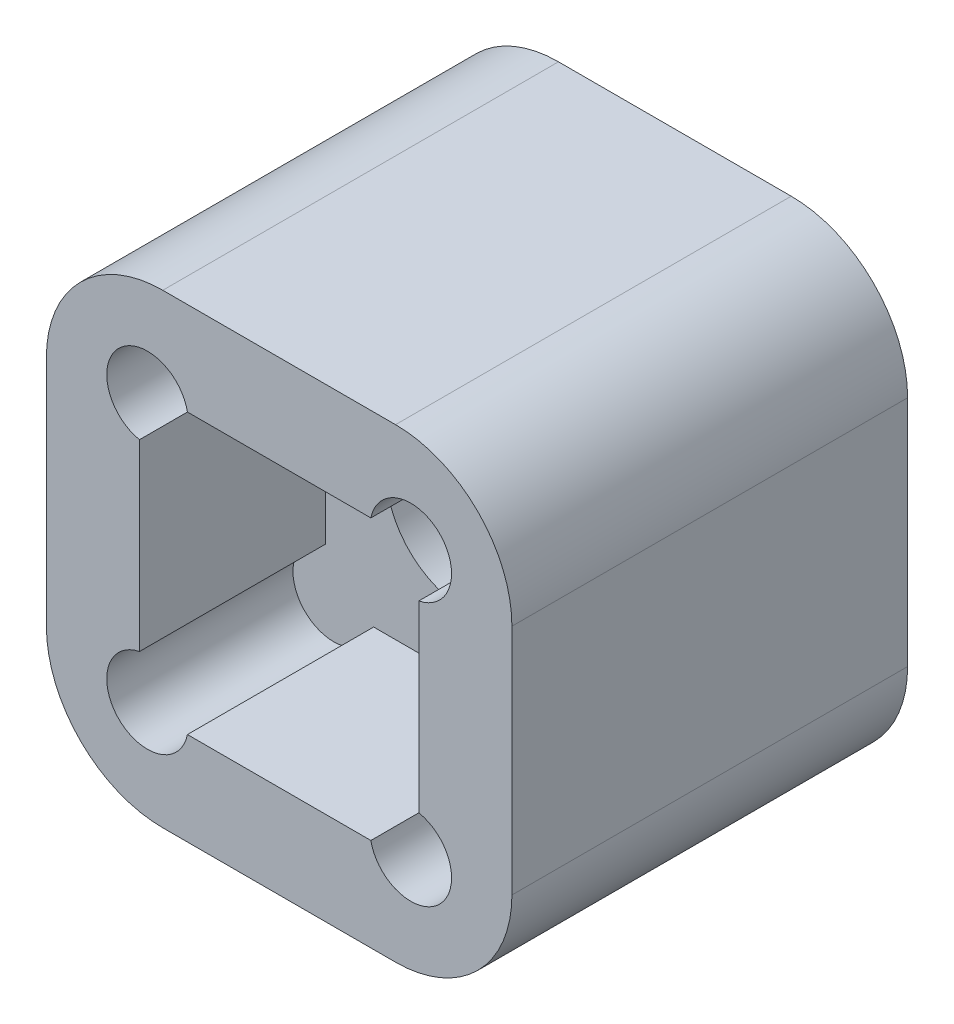
ISO-10303-21;
HEADER;
FILE_DESCRIPTION(('STEP AP214'),'2;1');
FILE_NAME('part.step','',(''),(''),'','','');
FILE_SCHEMA(('AUTOMOTIVE_DESIGN { 1 0 10303 214 1 1 1 1 }'));
ENDSEC;
DATA;
#1=APPLICATION_CONTEXT('core data for automotive mechanical design processes');
#2=APPLICATION_PROTOCOL_DEFINITION('international standard','automotive_design',2000,#1);
#3=PRODUCT_CONTEXT('',#1,'mechanical');
#4=PRODUCT('Part','Part','',(#3));
#5=PRODUCT_RELATED_PRODUCT_CATEGORY('part','',(#4));
#6=PRODUCT_DEFINITION_FORMATION('','',#4);
#7=PRODUCT_DEFINITION_CONTEXT('part definition',#1,'design');
#8=PRODUCT_DEFINITION('design','',#6,#7);
#9=PRODUCT_DEFINITION_SHAPE('','',#8);
#10=(LENGTH_UNIT() NAMED_UNIT(*) SI_UNIT(.MILLI.,.METRE.));
#11=(NAMED_UNIT(*) PLANE_ANGLE_UNIT() SI_UNIT($,.RADIAN.));
#12=(NAMED_UNIT(*) SI_UNIT($,.STERADIAN.) SOLID_ANGLE_UNIT());
#13=UNCERTAINTY_MEASURE_WITH_UNIT(LENGTH_MEASURE(1.E-05),#10,'distance_accuracy_value','');
#14=(GEOMETRIC_REPRESENTATION_CONTEXT(3) GLOBAL_UNCERTAINTY_ASSIGNED_CONTEXT((#13)) GLOBAL_UNIT_ASSIGNED_CONTEXT((#10,
#11,#12)) REPRESENTATION_CONTEXT('',''));
#15=CARTESIAN_POINT('',(0.,0.,0.));
#16=DIRECTION('',(0.,0.,1.));
#17=DIRECTION('',(1.,0.,0.));
#18=AXIS2_PLACEMENT_3D('',#15,#16,#17);
#19=CARTESIAN_POINT('',(0.,0.,0.));
#20=DIRECTION('',(0.,0.,-1.));
#21=DIRECTION('',(-1.,0.,0.));
#22=AXIS2_PLACEMENT_3D('',#19,#20,#21);
#23=CONICAL_SURFACE('',#22,3.15,0.785398163397448);
#24=CARTESIAN_POINT('',(0.,0.,1.45));
#25=DIRECTION('',(0.,0.,-1.));
#26=DIRECTION('',(-1.,0.,0.));
#27=AXIS2_PLACEMENT_3D('',#24,#25,#26);
#28=CIRCLE('',#27,1.7);
#29=CARTESIAN_POINT('',(1.7,0.,1.45));
#30=VERTEX_POINT('',#29);
#31=CARTESIAN_POINT('',(-1.7,0.,1.45));
#32=VERTEX_POINT('',#31);
#33=EDGE_CURVE('E41',#30,#32,#28,.T.);
#34=ORIENTED_EDGE('',*,*,#33,.F.);
#35=DIRECTION('',(0.707106781186547,0.,-0.707106781186548));
#36=VECTOR('',#35,1.);
#37=CARTESIAN_POINT('',(3.15,0.,0.));
#38=LINE('',#37,#36);
#39=CARTESIAN_POINT('',(3.15,0.,0.));
#40=VERTEX_POINT('',#39);
#41=EDGE_CURVE('E11',#30,#40,#38,.T.);
#42=ORIENTED_EDGE('',*,*,#41,.T.);
#43=CARTESIAN_POINT('',(0.,0.,0.));
#44=DIRECTION('',(0.,0.,-1.));
#45=DIRECTION('',(-1.,0.,0.));
#46=AXIS2_PLACEMENT_3D('',#43,#44,#45);
#47=CIRCLE('',#46,3.15);
#48=CARTESIAN_POINT('',(-3.15,0.,0.));
#49=VERTEX_POINT('',#48);
#50=EDGE_CURVE('E27',#40,#49,#47,.T.);
#51=ORIENTED_EDGE('',*,*,#50,.T.);
#52=DIRECTION('',(-0.707106781186547,0.,-0.707106781186548));
#53=VECTOR('',#52,1.);
#54=CARTESIAN_POINT('',(-3.15,0.,0.));
#55=LINE('',#54,#53);
#56=EDGE_CURVE('E266',#32,#49,#55,.T.);
#57=ORIENTED_EDGE('',*,*,#56,.F.);
#58=EDGE_LOOP('',(#34,#42,#51,#57));
#59=FACE_BOUND('',#58,.T.);
#60=ADVANCED_FACE('F16',(#59),#23,.F.);
#61=CARTESIAN_POINT('',(0.,0.,0.));
#62=DIRECTION('',(0.,0.,-1.));
#63=DIRECTION('',(-1.,0.,0.));
#64=AXIS2_PLACEMENT_3D('',#61,#62,#63);
#65=CYLINDRICAL_SURFACE('',#64,1.7);
#66=CARTESIAN_POINT('',(0.,0.,4.5));
#67=DIRECTION('',(0.,0.,-1.));
#68=DIRECTION('',(-1.,0.,0.));
#69=AXIS2_PLACEMENT_3D('',#66,#67,#68);
#70=CIRCLE('',#69,1.7);
#71=CARTESIAN_POINT('',(1.7,0.,4.5));
#72=VERTEX_POINT('',#71);
#73=CARTESIAN_POINT('',(-1.7,0.,4.5));
#74=VERTEX_POINT('',#73);
#75=EDGE_CURVE('E289',#72,#74,#70,.T.);
#76=ORIENTED_EDGE('',*,*,#75,.F.);
#77=DIRECTION('',(0.,0.,-1.));
#78=VECTOR('',#77,1.);
#79=CARTESIAN_POINT('',(1.7,0.,0.));
#80=LINE('',#79,#78);
#81=EDGE_CURVE('E264',#72,#30,#80,.T.);
#82=ORIENTED_EDGE('',*,*,#81,.T.);
#83=ORIENTED_EDGE('',*,*,#33,.T.);
#84=DIRECTION('',(0.,0.,-1.));
#85=VECTOR('',#84,1.);
#86=CARTESIAN_POINT('',(-1.7,0.,0.));
#87=LINE('',#86,#85);
#88=EDGE_CURVE('E260',#74,#32,#87,.T.);
#89=ORIENTED_EDGE('',*,*,#88,.F.);
#90=EDGE_LOOP('',(#76,#82,#83,#89));
#91=FACE_BOUND('',#90,.T.);
#92=ADVANCED_FACE('F687',(#91),#65,.F.);
#93=CARTESIAN_POINT('',(2.82842712474619,-2.82842712474619,2.02512626584708));
#94=DIRECTION('',(0.,0.,1.));
#95=DIRECTION('',(1.,0.,0.));
#96=AXIS2_PLACEMENT_3D('',#93,#94,#95);
#97=CYLINDRICAL_SURFACE('',#96,0.875);
#98=CARTESIAN_POINT('',(2.82842712474619,-2.82842712474619,4.5));
#99=DIRECTION('',(0.,0.,1.));
#100=DIRECTION('',(-1.,0.,0.));
#101=AXIS2_PLACEMENT_3D('',#98,#99,#100);
#102=CIRCLE('',#101,0.875);
#103=CARTESIAN_POINT('',(3.70342712474619,-2.82842712474619,4.5));
#104=VERTEX_POINT('',#103);
#105=CARTESIAN_POINT('',(3.,-1.97041328541891,4.5));
#106=VERTEX_POINT('',#105);
#107=EDGE_CURVE('E338',#104,#106,#102,.T.);
#108=ORIENTED_EDGE('',*,*,#107,.F.);
#109=DIRECTION('',(0.,0.,1.));
#110=VECTOR('',#109,1.);
#111=CARTESIAN_POINT('',(3.70342712474619,-2.82842712474619,2.02512626584708));
#112=LINE('',#111,#110);
#113=CARTESIAN_POINT('',(3.70342712474619,-2.82842712474619,8.5));
#114=VERTEX_POINT('',#113);
#115=EDGE_CURVE('E286',#104,#114,#112,.T.);
#116=ORIENTED_EDGE('',*,*,#115,.T.);
#117=CARTESIAN_POINT('',(2.82842712474619,-2.82842712474619,8.5));
#118=DIRECTION('',(0.,0.,1.));
#119=DIRECTION('',(1.,0.,0.));
#120=AXIS2_PLACEMENT_3D('',#117,#118,#119);
#121=CIRCLE('',#120,0.875);
#122=CARTESIAN_POINT('',(3.,-1.97041328541891,8.5));
#123=VERTEX_POINT('',#122);
#124=EDGE_CURVE('E83',#114,#123,#121,.T.);
#125=ORIENTED_EDGE('',*,*,#124,.T.);
#126=DIRECTION('',(0.,0.,1.));
#127=VECTOR('',#126,1.);
#128=CARTESIAN_POINT('',(3.,-1.97041328541891,2.02512626584708));
#129=LINE('',#128,#127);
#130=EDGE_CURVE('E100',#106,#123,#129,.T.);
#131=ORIENTED_EDGE('',*,*,#130,.F.);
#132=EDGE_LOOP('',(#108,#116,#125,#131));
#133=FACE_BOUND('',#132,.T.);
#134=ADVANCED_FACE('F691',(#133),#97,.F.);
#135=CARTESIAN_POINT('',(2.82842712474619,2.82842712474619,2.02512626584708));
#136=DIRECTION('',(0.,0.,1.));
#137=DIRECTION('',(1.,0.,0.));
#138=AXIS2_PLACEMENT_3D('',#135,#136,#137);
#139=CYLINDRICAL_SURFACE('',#138,0.875);
#140=CARTESIAN_POINT('',(2.82842712474619,2.82842712474619,4.5));
#141=DIRECTION('',(0.,0.,1.));
#142=DIRECTION('',(-1.,0.,0.));
#143=AXIS2_PLACEMENT_3D('',#140,#141,#142);
#144=CIRCLE('',#143,0.875);
#145=CARTESIAN_POINT('',(3.70342712474619,2.82842712474619,4.5));
#146=VERTEX_POINT('',#145);
#147=CARTESIAN_POINT('',(1.97041328541891,3.,4.5));
#148=VERTEX_POINT('',#147);
#149=EDGE_CURVE('E240',#146,#148,#144,.T.);
#150=ORIENTED_EDGE('',*,*,#149,.F.);
#151=DIRECTION('',(0.,0.,1.));
#152=VECTOR('',#151,1.);
#153=CARTESIAN_POINT('',(3.70342712474619,2.82842712474619,2.02512626584708));
#154=LINE('',#153,#152);
#155=CARTESIAN_POINT('',(3.70342712474619,2.82842712474619,8.5));
#156=VERTEX_POINT('',#155);
#157=EDGE_CURVE('E20',#146,#156,#154,.T.);
#158=ORIENTED_EDGE('',*,*,#157,.T.);
#159=CARTESIAN_POINT('',(2.82842712474619,2.82842712474619,8.5));
#160=DIRECTION('',(0.,0.,1.));
#161=DIRECTION('',(1.,0.,0.));
#162=AXIS2_PLACEMENT_3D('',#159,#160,#161);
#163=CIRCLE('',#162,0.875);
#164=CARTESIAN_POINT('',(1.97041328541891,3.,8.5));
#165=VERTEX_POINT('',#164);
#166=EDGE_CURVE('E226',#156,#165,#163,.T.);
#167=ORIENTED_EDGE('',*,*,#166,.T.);
#168=DIRECTION('',(0.,0.,1.));
#169=VECTOR('',#168,1.);
#170=CARTESIAN_POINT('',(1.97041328541891,3.,2.02512626584708));
#171=LINE('',#170,#169);
#172=EDGE_CURVE('E376',#148,#165,#171,.T.);
#173=ORIENTED_EDGE('',*,*,#172,.F.);
#174=EDGE_LOOP('',(#150,#158,#167,#173));
#175=FACE_BOUND('',#174,.T.);
#176=ADVANCED_FACE('F239',(#175),#139,.F.);
#177=CARTESIAN_POINT('',(-5.,5.,8.5));
#178=DIRECTION('',(1.,0.,0.));
#179=DIRECTION('',(0.,1.,0.));
#180=AXIS2_PLACEMENT_3D('',#177,#178,#179);
#181=PLANE('',#180);
#182=DIRECTION('',(0.,-1.,0.));
#183=VECTOR('',#182,1.);
#184=CARTESIAN_POINT('',(-5.,5.,0.));
#185=LINE('',#184,#183);
#186=CARTESIAN_POINT('',(-5.,2.5,0.));
#187=VERTEX_POINT('',#186);
#188=CARTESIAN_POINT('',(-5.,-2.5,0.));
#189=VERTEX_POINT('',#188);
#190=EDGE_CURVE('E236',#187,#189,#185,.T.);
#191=ORIENTED_EDGE('',*,*,#190,.T.);
#192=DIRECTION('',(0.,0.,1.));
#193=VECTOR('',#192,1.);
#194=CARTESIAN_POINT('',(-5.,-2.5,8.5));
#195=LINE('',#194,#193);
#196=CARTESIAN_POINT('',(-5.,-2.5,8.5));
#197=VERTEX_POINT('',#196);
#198=EDGE_CURVE('E390',#189,#197,#195,.T.);
#199=ORIENTED_EDGE('',*,*,#198,.T.);
#200=DIRECTION('',(0.,-1.,0.));
#201=VECTOR('',#200,1.);
#202=CARTESIAN_POINT('',(-5.,5.,8.5));
#203=LINE('',#202,#201);
#204=CARTESIAN_POINT('',(-5.,2.5,8.5));
#205=VERTEX_POINT('',#204);
#206=EDGE_CURVE('E279',#205,#197,#203,.T.);
#207=ORIENTED_EDGE('',*,*,#206,.F.);
#208=DIRECTION('',(0.,0.,-1.));
#209=VECTOR('',#208,1.);
#210=CARTESIAN_POINT('',(-5.,2.5,8.5));
#211=LINE('',#210,#209);
#212=EDGE_CURVE('E401',#205,#187,#211,.T.);
#213=ORIENTED_EDGE('',*,*,#212,.T.);
#214=EDGE_LOOP('',(#191,#199,#207,#213));
#215=FACE_BOUND('',#214,.T.);
#216=ADVANCED_FACE('F697',(#215),#181,.F.);
#217=CARTESIAN_POINT('',(5.,-5.,8.5));
#218=DIRECTION('',(0.,1.,0.));
#219=DIRECTION('',(1.,0.,0.));
#220=AXIS2_PLACEMENT_3D('',#217,#218,#219);
#221=PLANE('',#220);
#222=DIRECTION('',(1.,0.,0.));
#223=VECTOR('',#222,1.);
#224=CARTESIAN_POINT('',(5.,-5.,8.5));
#225=LINE('',#224,#223);
#226=CARTESIAN_POINT('',(-2.5,-5.,8.5));
#227=VERTEX_POINT('',#226);
#228=CARTESIAN_POINT('',(2.5,-5.,8.5));
#229=VERTEX_POINT('',#228);
#230=EDGE_CURVE('E280',#227,#229,#225,.T.);
#231=ORIENTED_EDGE('',*,*,#230,.F.);
#232=DIRECTION('',(0.,0.,-1.));
#233=VECTOR('',#232,1.);
#234=CARTESIAN_POINT('',(-2.5,-5.,8.5));
#235=LINE('',#234,#233);
#236=CARTESIAN_POINT('',(-2.5,-5.,0.));
#237=VERTEX_POINT('',#236);
#238=EDGE_CURVE('E383',#227,#237,#235,.T.);
#239=ORIENTED_EDGE('',*,*,#238,.T.);
#240=DIRECTION('',(1.,0.,0.));
#241=VECTOR('',#240,1.);
#242=CARTESIAN_POINT('',(5.,-5.,0.));
#243=LINE('',#242,#241);
#244=CARTESIAN_POINT('',(2.5,-5.,0.));
#245=VERTEX_POINT('',#244);
#246=EDGE_CURVE('E379',#237,#245,#243,.T.);
#247=ORIENTED_EDGE('',*,*,#246,.T.);
#248=DIRECTION('',(0.,0.,1.));
#249=VECTOR('',#248,1.);
#250=CARTESIAN_POINT('',(2.5,-5.,8.5));
#251=LINE('',#250,#249);
#252=EDGE_CURVE('E358',#245,#229,#251,.T.);
#253=ORIENTED_EDGE('',*,*,#252,.T.);
#254=EDGE_LOOP('',(#231,#239,#247,#253));
#255=FACE_BOUND('',#254,.T.);
#256=ADVANCED_FACE('F452',(#255),#221,.F.);
#257=CARTESIAN_POINT('',(5.,5.,8.5));
#258=DIRECTION('',(-1.,0.,0.));
#259=DIRECTION('',(0.,1.,0.));
#260=AXIS2_PLACEMENT_3D('',#257,#258,#259);
#261=PLANE('',#260);
#262=DIRECTION('',(0.,1.,0.));
#263=VECTOR('',#262,1.);
#264=CARTESIAN_POINT('',(5.,5.,0.));
#265=LINE('',#264,#263);
#266=CARTESIAN_POINT('',(5.,-2.5,0.));
#267=VERTEX_POINT('',#266);
#268=CARTESIAN_POINT('',(5.,2.5,0.));
#269=VERTEX_POINT('',#268);
#270=EDGE_CURVE('E319',#267,#269,#265,.T.);
#271=ORIENTED_EDGE('',*,*,#270,.T.);
#272=DIRECTION('',(0.,0.,1.));
#273=VECTOR('',#272,1.);
#274=CARTESIAN_POINT('',(5.,2.5,8.5));
#275=LINE('',#274,#273);
#276=CARTESIAN_POINT('',(5.,2.5,8.5));
#277=VERTEX_POINT('',#276);
#278=EDGE_CURVE('E316',#269,#277,#275,.T.);
#279=ORIENTED_EDGE('',*,*,#278,.T.);
#280=DIRECTION('',(0.,1.,0.));
#281=VECTOR('',#280,1.);
#282=CARTESIAN_POINT('',(5.,5.,8.5));
#283=LINE('',#282,#281);
#284=CARTESIAN_POINT('',(5.,-2.5,8.5));
#285=VERTEX_POINT('',#284);
#286=EDGE_CURVE('E299',#285,#277,#283,.T.);
#287=ORIENTED_EDGE('',*,*,#286,.F.);
#288=DIRECTION('',(0.,0.,-1.));
#289=VECTOR('',#288,1.);
#290=CARTESIAN_POINT('',(5.,-2.5,8.5));
#291=LINE('',#290,#289);
#292=EDGE_CURVE('E320',#285,#267,#291,.T.);
#293=ORIENTED_EDGE('',*,*,#292,.T.);
#294=EDGE_LOOP('',(#271,#279,#287,#293));
#295=FACE_BOUND('',#294,.T.);
#296=ADVANCED_FACE('F460',(#295),#261,.F.);
#297=CARTESIAN_POINT('',(5.,5.,8.5));
#298=DIRECTION('',(0.,-1.,0.));
#299=DIRECTION('',(0.,0.,-1.));
#300=AXIS2_PLACEMENT_3D('',#297,#298,#299);
#301=PLANE('',#300);
#302=DIRECTION('',(-1.,0.,0.));
#303=VECTOR('',#302,1.);
#304=CARTESIAN_POINT('',(5.,5.,0.));
#305=LINE('',#304,#303);
#306=CARTESIAN_POINT('',(2.5,5.,0.));
#307=VERTEX_POINT('',#306);
#308=CARTESIAN_POINT('',(-2.5,5.,0.));
#309=VERTEX_POINT('',#308);
#310=EDGE_CURVE('E361',#307,#309,#305,.T.);
#311=ORIENTED_EDGE('',*,*,#310,.T.);
#312=DIRECTION('',(0.,0.,1.));
#313=VECTOR('',#312,1.);
#314=CARTESIAN_POINT('',(-2.5,5.,8.5));
#315=LINE('',#314,#313);
#316=CARTESIAN_POINT('',(-2.5,5.,8.5));
#317=VERTEX_POINT('',#316);
#318=EDGE_CURVE('E362',#309,#317,#315,.T.);
#319=ORIENTED_EDGE('',*,*,#318,.T.);
#320=DIRECTION('',(-1.,0.,0.));
#321=VECTOR('',#320,1.);
#322=CARTESIAN_POINT('',(5.,5.,8.5));
#323=LINE('',#322,#321);
#324=CARTESIAN_POINT('',(2.5,5.,8.5));
#325=VERTEX_POINT('',#324);
#326=EDGE_CURVE('E370',#325,#317,#323,.T.);
#327=ORIENTED_EDGE('',*,*,#326,.F.);
#328=DIRECTION('',(0.,0.,-1.));
#329=VECTOR('',#328,1.);
#330=CARTESIAN_POINT('',(2.5,5.,8.5));
#331=LINE('',#330,#329);
#332=EDGE_CURVE('E327',#325,#307,#331,.T.);
#333=ORIENTED_EDGE('',*,*,#332,.T.);
#334=EDGE_LOOP('',(#311,#319,#327,#333));
#335=FACE_BOUND('',#334,.T.);
#336=ADVANCED_FACE('F674',(#335),#301,.F.);
#337=CARTESIAN_POINT('',(0.,0.,8.5));
#338=DIRECTION('',(0.,0.,-1.));
#339=DIRECTION('',(0.,-1.,0.));
#340=AXIS2_PLACEMENT_3D('',#337,#338,#339);
#341=PLANE('',#340);
#342=ORIENTED_EDGE('',*,*,#206,.T.);
#343=CARTESIAN_POINT('',(-2.5,-2.5,8.5));
#344=DIRECTION('',(0.,0.,1.));
#345=DIRECTION('',(-1.,0.,0.));
#346=AXIS2_PLACEMENT_3D('',#343,#344,#345);
#347=CIRCLE('',#346,2.5);
#348=EDGE_CURVE('E275',#197,#227,#347,.T.);
#349=ORIENTED_EDGE('',*,*,#348,.T.);
#350=ORIENTED_EDGE('',*,*,#230,.T.);
#351=CARTESIAN_POINT('',(2.5,-2.5,8.5));
#352=DIRECTION('',(0.,0.,1.));
#353=DIRECTION('',(-1.,0.,0.));
#354=AXIS2_PLACEMENT_3D('',#351,#352,#353);
#355=CIRCLE('',#354,2.5);
#356=EDGE_CURVE('E296',#229,#285,#355,.T.);
#357=ORIENTED_EDGE('',*,*,#356,.T.);
#358=ORIENTED_EDGE('',*,*,#286,.T.);
#359=CARTESIAN_POINT('',(2.5,2.5,8.5));
#360=DIRECTION('',(0.,0.,1.));
#361=DIRECTION('',(-1.,0.,0.));
#362=AXIS2_PLACEMENT_3D('',#359,#360,#361);
#363=CIRCLE('',#362,2.5);
#364=EDGE_CURVE('E307',#277,#325,#363,.T.);
#365=ORIENTED_EDGE('',*,*,#364,.T.);
#366=ORIENTED_EDGE('',*,*,#326,.T.);
#367=CARTESIAN_POINT('',(-2.5,2.5,8.5));
#368=DIRECTION('',(0.,0.,1.));
#369=DIRECTION('',(-1.,0.,0.));
#370=AXIS2_PLACEMENT_3D('',#367,#368,#369);
#371=CIRCLE('',#370,2.5);
#372=EDGE_CURVE('E366',#317,#205,#371,.T.);
#373=ORIENTED_EDGE('',*,*,#372,.T.);
#374=EDGE_LOOP('',(#342,#349,#350,#357,#358,#365,#366,#373));
#375=FACE_BOUND('',#374,.T.);
#376=DIRECTION('',(0.,1.,0.));
#377=VECTOR('',#376,1.);
#378=CARTESIAN_POINT('',(3.,-3.,8.5));
#379=LINE('',#378,#377);
#380=CARTESIAN_POINT('',(3.,1.97041328541891,8.5));
#381=VERTEX_POINT('',#380);
#382=EDGE_CURVE('E301',#123,#381,#379,.T.);
#383=ORIENTED_EDGE('',*,*,#382,.F.);
#384=ORIENTED_EDGE('',*,*,#124,.F.);
#385=CARTESIAN_POINT('',(2.82842712474619,-2.82842712474619,8.5));
#386=DIRECTION('',(0.,0.,1.));
#387=DIRECTION('',(1.,0.,0.));
#388=AXIS2_PLACEMENT_3D('',#385,#386,#387);
#389=CIRCLE('',#388,0.875);
#390=CARTESIAN_POINT('',(1.97041328541891,-3.,8.5));
#391=VERTEX_POINT('',#390);
#392=EDGE_CURVE('E249',#391,#114,#389,.T.);
#393=ORIENTED_EDGE('',*,*,#392,.F.);
#394=DIRECTION('',(1.,0.,0.));
#395=VECTOR('',#394,1.);
#396=CARTESIAN_POINT('',(-3.,-3.,8.5));
#397=LINE('',#396,#395);
#398=CARTESIAN_POINT('',(-1.97041328541891,-3.,8.5));
#399=VERTEX_POINT('',#398);
#400=EDGE_CURVE('E410',#399,#391,#397,.T.);
#401=ORIENTED_EDGE('',*,*,#400,.F.);
#402=CARTESIAN_POINT('',(-2.82842712474619,-2.82842712474619,8.5));
#403=DIRECTION('',(0.,0.,1.));
#404=DIRECTION('',(1.,0.,0.));
#405=AXIS2_PLACEMENT_3D('',#402,#403,#404);
#406=CIRCLE('',#405,0.875);
#407=CARTESIAN_POINT('',(-3.,-1.97041328541891,8.5));
#408=VERTEX_POINT('',#407);
#409=EDGE_CURVE('E256',#408,#399,#406,.T.);
#410=ORIENTED_EDGE('',*,*,#409,.F.);
#411=DIRECTION('',(0.,-1.,0.));
#412=VECTOR('',#411,1.);
#413=CARTESIAN_POINT('',(-3.,-3.,8.5));
#414=LINE('',#413,#412);
#415=CARTESIAN_POINT('',(-3.,1.97041328541891,8.5));
#416=VERTEX_POINT('',#415);
#417=EDGE_CURVE('E295',#416,#408,#414,.T.);
#418=ORIENTED_EDGE('',*,*,#417,.F.);
#419=CARTESIAN_POINT('',(-2.82842712474619,2.82842712474619,8.5));
#420=DIRECTION('',(0.,0.,1.));
#421=DIRECTION('',(1.,0.,0.));
#422=AXIS2_PLACEMENT_3D('',#419,#420,#421);
#423=CIRCLE('',#422,0.875);
#424=CARTESIAN_POINT('',(-1.97041328541891,3.,8.5));
#425=VERTEX_POINT('',#424);
#426=EDGE_CURVE('E248',#425,#416,#423,.T.);
#427=ORIENTED_EDGE('',*,*,#426,.F.);
#428=DIRECTION('',(-1.,0.,0.));
#429=VECTOR('',#428,1.);
#430=CARTESIAN_POINT('',(-3.,3.,8.5));
#431=LINE('',#430,#429);
#432=EDGE_CURVE('E232',#165,#425,#431,.T.);
#433=ORIENTED_EDGE('',*,*,#432,.F.);
#434=ORIENTED_EDGE('',*,*,#166,.F.);
#435=CARTESIAN_POINT('',(2.82842712474619,2.82842712474619,8.5));
#436=DIRECTION('',(0.,0.,1.));
#437=DIRECTION('',(1.,0.,0.));
#438=AXIS2_PLACEMENT_3D('',#435,#436,#437);
#439=CIRCLE('',#438,0.875);
#440=EDGE_CURVE('E230',#381,#156,#439,.T.);
#441=ORIENTED_EDGE('',*,*,#440,.F.);
#442=EDGE_LOOP('',(#383,#384,#393,#401,#410,#418,#427,#433,#434,#441));
#443=FACE_BOUND('',#442,.T.);
#444=ADVANCED_FACE('F228',(#375,#443),#341,.F.);
#445=CARTESIAN_POINT('',(0.,0.,0.));
#446=DIRECTION('',(0.,0.,-1.));
#447=DIRECTION('',(0.,-1.,0.));
#448=AXIS2_PLACEMENT_3D('',#445,#446,#447);
#449=PLANE('',#448);
#450=ORIENTED_EDGE('',*,*,#246,.F.);
#451=CARTESIAN_POINT('',(-2.5,-2.5,0.));
#452=DIRECTION('',(0.,0.,-1.));
#453=DIRECTION('',(-1.,0.,0.));
#454=AXIS2_PLACEMENT_3D('',#451,#452,#453);
#455=CIRCLE('',#454,2.5);
#456=EDGE_CURVE('E345',#237,#189,#455,.T.);
#457=ORIENTED_EDGE('',*,*,#456,.T.);
#458=ORIENTED_EDGE('',*,*,#190,.F.);
#459=CARTESIAN_POINT('',(-2.5,2.5,0.));
#460=DIRECTION('',(0.,0.,-1.));
#461=DIRECTION('',(-1.,0.,0.));
#462=AXIS2_PLACEMENT_3D('',#459,#460,#461);
#463=CIRCLE('',#462,2.5);
#464=EDGE_CURVE('E341',#187,#309,#463,.T.);
#465=ORIENTED_EDGE('',*,*,#464,.T.);
#466=ORIENTED_EDGE('',*,*,#310,.F.);
#467=CARTESIAN_POINT('',(2.5,2.5,0.));
#468=DIRECTION('',(0.,0.,-1.));
#469=DIRECTION('',(-1.,0.,0.));
#470=AXIS2_PLACEMENT_3D('',#467,#468,#469);
#471=CIRCLE('',#470,2.5);
#472=EDGE_CURVE('E346',#307,#269,#471,.T.);
#473=ORIENTED_EDGE('',*,*,#472,.T.);
#474=ORIENTED_EDGE('',*,*,#270,.F.);
#475=CARTESIAN_POINT('',(2.5,-2.5,0.));
#476=DIRECTION('',(0.,0.,-1.));
#477=DIRECTION('',(-1.,0.,0.));
#478=AXIS2_PLACEMENT_3D('',#475,#476,#477);
#479=CIRCLE('',#478,2.5);
#480=EDGE_CURVE('E394',#267,#245,#479,.T.);
#481=ORIENTED_EDGE('',*,*,#480,.T.);
#482=EDGE_LOOP('',(#450,#457,#458,#465,#466,#473,#474,#481));
#483=FACE_BOUND('',#482,.T.);
#484=CARTESIAN_POINT('',(0.,0.,0.));
#485=DIRECTION('',(0.,0.,-1.));
#486=DIRECTION('',(-1.,0.,0.));
#487=AXIS2_PLACEMENT_3D('',#484,#485,#486);
#488=CIRCLE('',#487,3.15);
#489=EDGE_CURVE('E269',#49,#40,#488,.T.);
#490=ORIENTED_EDGE('',*,*,#489,.F.);
#491=ORIENTED_EDGE('',*,*,#50,.F.);
#492=EDGE_LOOP('',(#490,#491));
#493=FACE_BOUND('',#492,.T.);
#494=ADVANCED_FACE('F462',(#483,#493),#449,.T.);
#495=CARTESIAN_POINT('',(3.,-3.,4.5));
#496=DIRECTION('',(1.,0.,0.));
#497=DIRECTION('',(0.,1.,0.));
#498=AXIS2_PLACEMENT_3D('',#495,#496,#497);
#499=PLANE('',#498);
#500=DIRECTION('',(0.,1.,0.));
#501=VECTOR('',#500,1.);
#502=CARTESIAN_POINT('',(3.,-3.,4.5));
#503=LINE('',#502,#501);
#504=CARTESIAN_POINT('',(3.,1.97041328541891,4.5));
#505=VERTEX_POINT('',#504);
#506=EDGE_CURVE('E185',#106,#505,#503,.T.);
#507=ORIENTED_EDGE('',*,*,#506,.F.);
#508=ORIENTED_EDGE('',*,*,#130,.T.);
#509=ORIENTED_EDGE('',*,*,#382,.T.);
#510=DIRECTION('',(0.,0.,-1.));
#511=VECTOR('',#510,1.);
#512=CARTESIAN_POINT('',(3.,1.97041328541891,2.02512626584708));
#513=LINE('',#512,#511);
#514=EDGE_CURVE('E246',#381,#505,#513,.T.);
#515=ORIENTED_EDGE('',*,*,#514,.T.);
#516=EDGE_LOOP('',(#507,#508,#509,#515));
#517=FACE_BOUND('',#516,.T.);
#518=ADVANCED_FACE('F798',(#517),#499,.F.);
#519=CARTESIAN_POINT('',(-3.,-3.,4.5));
#520=DIRECTION('',(0.,-1.,0.));
#521=DIRECTION('',(0.,0.,-1.));
#522=AXIS2_PLACEMENT_3D('',#519,#520,#521);
#523=PLANE('',#522);
#524=ORIENTED_EDGE('',*,*,#400,.T.);
#525=DIRECTION('',(0.,0.,-1.));
#526=VECTOR('',#525,1.);
#527=CARTESIAN_POINT('',(1.97041328541891,-3.,2.02512626584708));
#528=LINE('',#527,#526);
#529=CARTESIAN_POINT('',(1.97041328541891,-3.,4.5));
#530=VERTEX_POINT('',#529);
#531=EDGE_CURVE('E414',#391,#530,#528,.T.);
#532=ORIENTED_EDGE('',*,*,#531,.T.);
#533=DIRECTION('',(1.,0.,0.));
#534=VECTOR('',#533,1.);
#535=CARTESIAN_POINT('',(-3.,-3.,4.5));
#536=LINE('',#535,#534);
#537=CARTESIAN_POINT('',(-1.97041328541891,-3.,4.5));
#538=VERTEX_POINT('',#537);
#539=EDGE_CURVE('E197',#538,#530,#536,.T.);
#540=ORIENTED_EDGE('',*,*,#539,.F.);
#541=DIRECTION('',(0.,0.,1.));
#542=VECTOR('',#541,1.);
#543=CARTESIAN_POINT('',(-1.97041328541891,-3.,2.02512626584708));
#544=LINE('',#543,#542);
#545=EDGE_CURVE('E294',#538,#399,#544,.T.);
#546=ORIENTED_EDGE('',*,*,#545,.T.);
#547=EDGE_LOOP('',(#524,#532,#540,#546));
#548=FACE_BOUND('',#547,.T.);
#549=ADVANCED_FACE('F18',(#548),#523,.F.);
#550=CARTESIAN_POINT('',(-3.,-3.,4.5));
#551=DIRECTION('',(-1.,0.,0.));
#552=DIRECTION('',(0.,0.,1.));
#553=AXIS2_PLACEMENT_3D('',#550,#551,#552);
#554=PLANE('',#553);
#555=DIRECTION('',(0.,-1.,0.));
#556=VECTOR('',#555,1.);
#557=CARTESIAN_POINT('',(-3.,-3.,4.5));
#558=LINE('',#557,#556);
#559=CARTESIAN_POINT('',(-3.,1.97041328541891,4.5));
#560=VERTEX_POINT('',#559);
#561=CARTESIAN_POINT('',(-3.,-1.97041328541891,4.5));
#562=VERTEX_POINT('',#561);
#563=EDGE_CURVE('E315',#560,#562,#558,.T.);
#564=ORIENTED_EDGE('',*,*,#563,.F.);
#565=DIRECTION('',(0.,0.,1.));
#566=VECTOR('',#565,1.);
#567=CARTESIAN_POINT('',(-3.,1.97041328541891,2.02512626584708));
#568=LINE('',#567,#566);
#569=EDGE_CURVE('E290',#560,#416,#568,.T.);
#570=ORIENTED_EDGE('',*,*,#569,.T.);
#571=ORIENTED_EDGE('',*,*,#417,.T.);
#572=DIRECTION('',(0.,0.,-1.));
#573=VECTOR('',#572,1.);
#574=CARTESIAN_POINT('',(-3.,-1.97041328541891,2.02512626584708));
#575=LINE('',#574,#573);
#576=EDGE_CURVE('E331',#408,#562,#575,.T.);
#577=ORIENTED_EDGE('',*,*,#576,.T.);
#578=EDGE_LOOP('',(#564,#570,#571,#577));
#579=FACE_BOUND('',#578,.T.);
#580=ADVANCED_FACE('F711',(#579),#554,.F.);
#581=CARTESIAN_POINT('',(-3.,3.,4.5));
#582=DIRECTION('',(0.,1.,0.));
#583=DIRECTION('',(1.,0.,0.));
#584=AXIS2_PLACEMENT_3D('',#581,#582,#583);
#585=PLANE('',#584);
#586=DIRECTION('',(-1.,0.,0.));
#587=VECTOR('',#586,1.);
#588=CARTESIAN_POINT('',(-3.,3.,4.5));
#589=LINE('',#588,#587);
#590=CARTESIAN_POINT('',(-1.97041328541891,3.,4.5));
#591=VERTEX_POINT('',#590);
#592=EDGE_CURVE('E314',#148,#591,#589,.T.);
#593=ORIENTED_EDGE('',*,*,#592,.F.);
#594=ORIENTED_EDGE('',*,*,#172,.T.);
#595=ORIENTED_EDGE('',*,*,#432,.T.);
#596=DIRECTION('',(0.,0.,-1.));
#597=VECTOR('',#596,1.);
#598=CARTESIAN_POINT('',(-1.97041328541891,3.,2.02512626584708));
#599=LINE('',#598,#597);
#600=EDGE_CURVE('E270',#425,#591,#599,.T.);
#601=ORIENTED_EDGE('',*,*,#600,.T.);
#602=EDGE_LOOP('',(#593,#594,#595,#601));
#603=FACE_BOUND('',#602,.T.);
#604=ADVANCED_FACE('F706',(#603),#585,.F.);
#605=CARTESIAN_POINT('',(0.,0.,4.5));
#606=DIRECTION('',(0.,0.,-1.));
#607=DIRECTION('',(0.,-1.,0.));
#608=AXIS2_PLACEMENT_3D('',#605,#606,#607);
#609=PLANE('',#608);
#610=CARTESIAN_POINT('',(2.82842712474619,-2.82842712474619,4.5));
#611=DIRECTION('',(0.,0.,1.));
#612=DIRECTION('',(-1.,0.,0.));
#613=AXIS2_PLACEMENT_3D('',#610,#611,#612);
#614=CIRCLE('',#613,0.875);
#615=EDGE_CURVE('E274',#530,#104,#614,.T.);
#616=ORIENTED_EDGE('',*,*,#615,.T.);
#617=ORIENTED_EDGE('',*,*,#107,.T.);
#618=ORIENTED_EDGE('',*,*,#506,.T.);
#619=CARTESIAN_POINT('',(2.82842712474619,2.82842712474619,4.5));
#620=DIRECTION('',(0.,0.,1.));
#621=DIRECTION('',(-1.,0.,0.));
#622=AXIS2_PLACEMENT_3D('',#619,#620,#621);
#623=CIRCLE('',#622,0.875);
#624=EDGE_CURVE('E324',#505,#146,#623,.T.);
#625=ORIENTED_EDGE('',*,*,#624,.T.);
#626=ORIENTED_EDGE('',*,*,#149,.T.);
#627=ORIENTED_EDGE('',*,*,#592,.T.);
#628=CARTESIAN_POINT('',(-2.82842712474619,2.82842712474619,4.5));
#629=DIRECTION('',(0.,0.,1.));
#630=DIRECTION('',(-1.,0.,0.));
#631=AXIS2_PLACEMENT_3D('',#628,#629,#630);
#632=CIRCLE('',#631,0.875);
#633=EDGE_CURVE('E310',#591,#560,#632,.T.);
#634=ORIENTED_EDGE('',*,*,#633,.T.);
#635=ORIENTED_EDGE('',*,*,#563,.T.);
#636=CARTESIAN_POINT('',(-2.82842712474619,-2.82842712474619,4.5));
#637=DIRECTION('',(0.,0.,1.));
#638=DIRECTION('',(-1.,0.,0.));
#639=AXIS2_PLACEMENT_3D('',#636,#637,#638);
#640=CIRCLE('',#639,0.875);
#641=EDGE_CURVE('E332',#562,#538,#640,.T.);
#642=ORIENTED_EDGE('',*,*,#641,.T.);
#643=ORIENTED_EDGE('',*,*,#539,.T.);
#644=EDGE_LOOP('',(#616,#617,#618,#625,#626,#627,#634,#635,#642,#643));
#645=FACE_BOUND('',#644,.T.);
#646=CARTESIAN_POINT('',(0.,0.,4.5));
#647=DIRECTION('',(0.,0.,-1.));
#648=DIRECTION('',(-1.,0.,0.));
#649=AXIS2_PLACEMENT_3D('',#646,#647,#648);
#650=CIRCLE('',#649,1.7);
#651=EDGE_CURVE('E352',#74,#72,#650,.T.);
#652=ORIENTED_EDGE('',*,*,#651,.T.);
#653=ORIENTED_EDGE('',*,*,#75,.T.);
#654=EDGE_LOOP('',(#652,#653));
#655=FACE_BOUND('',#654,.T.);
#656=ADVANCED_FACE('F710',(#645,#655),#609,.F.);
#657=CARTESIAN_POINT('',(-2.82842712474619,-2.82842712474619,2.02512626584708));
#658=DIRECTION('',(0.,0.,1.));
#659=DIRECTION('',(1.,0.,0.));
#660=AXIS2_PLACEMENT_3D('',#657,#658,#659);
#661=CYLINDRICAL_SURFACE('',#660,0.875);
#662=ORIENTED_EDGE('',*,*,#641,.F.);
#663=ORIENTED_EDGE('',*,*,#576,.F.);
#664=ORIENTED_EDGE('',*,*,#409,.T.);
#665=ORIENTED_EDGE('',*,*,#545,.F.);
#666=EDGE_LOOP('',(#662,#663,#664,#665));
#667=FACE_BOUND('',#666,.T.);
#668=ADVANCED_FACE('F728',(#667),#661,.F.);
#669=CARTESIAN_POINT('',(-2.82842712474619,2.82842712474619,2.02512626584708));
#670=DIRECTION('',(0.,0.,1.));
#671=DIRECTION('',(1.,0.,0.));
#672=AXIS2_PLACEMENT_3D('',#669,#670,#671);
#673=CYLINDRICAL_SURFACE('',#672,0.875);
#674=ORIENTED_EDGE('',*,*,#633,.F.);
#675=ORIENTED_EDGE('',*,*,#600,.F.);
#676=ORIENTED_EDGE('',*,*,#426,.T.);
#677=ORIENTED_EDGE('',*,*,#569,.F.);
#678=EDGE_LOOP('',(#674,#675,#676,#677));
#679=FACE_BOUND('',#678,.T.);
#680=ADVANCED_FACE('F759',(#679),#673,.F.);
#681=CARTESIAN_POINT('',(2.82842712474619,2.82842712474619,2.02512626584708));
#682=DIRECTION('',(0.,0.,1.));
#683=DIRECTION('',(1.,0.,0.));
#684=AXIS2_PLACEMENT_3D('',#681,#682,#683);
#685=CYLINDRICAL_SURFACE('',#684,0.875);
#686=ORIENTED_EDGE('',*,*,#157,.F.);
#687=ORIENTED_EDGE('',*,*,#624,.F.);
#688=ORIENTED_EDGE('',*,*,#514,.F.);
#689=ORIENTED_EDGE('',*,*,#440,.T.);
#690=EDGE_LOOP('',(#686,#687,#688,#689));
#691=FACE_BOUND('',#690,.T.);
#692=ADVANCED_FACE('F245',(#691),#685,.F.);
#693=CARTESIAN_POINT('',(2.82842712474619,-2.82842712474619,2.02512626584708));
#694=DIRECTION('',(0.,0.,1.));
#695=DIRECTION('',(1.,0.,0.));
#696=AXIS2_PLACEMENT_3D('',#693,#694,#695);
#697=CYLINDRICAL_SURFACE('',#696,0.875);
#698=ORIENTED_EDGE('',*,*,#115,.F.);
#699=ORIENTED_EDGE('',*,*,#615,.F.);
#700=ORIENTED_EDGE('',*,*,#531,.F.);
#701=ORIENTED_EDGE('',*,*,#392,.T.);
#702=EDGE_LOOP('',(#698,#699,#700,#701));
#703=FACE_BOUND('',#702,.T.);
#704=ADVANCED_FACE('F758',(#703),#697,.F.);
#705=CARTESIAN_POINT('',(-2.5,-2.5,8.5));
#706=DIRECTION('',(0.,0.,-1.));
#707=DIRECTION('',(-1.,0.,0.));
#708=AXIS2_PLACEMENT_3D('',#705,#706,#707);
#709=CYLINDRICAL_SURFACE('',#708,2.5);
#710=ORIENTED_EDGE('',*,*,#348,.F.);
#711=ORIENTED_EDGE('',*,*,#198,.F.);
#712=ORIENTED_EDGE('',*,*,#456,.F.);
#713=ORIENTED_EDGE('',*,*,#238,.F.);
#714=EDGE_LOOP('',(#710,#711,#712,#713));
#715=FACE_BOUND('',#714,.T.);
#716=ADVANCED_FACE('F767',(#715),#709,.T.);
#717=CARTESIAN_POINT('',(-2.5,2.5,8.5));
#718=DIRECTION('',(0.,0.,-1.));
#719=DIRECTION('',(-1.,0.,0.));
#720=AXIS2_PLACEMENT_3D('',#717,#718,#719);
#721=CYLINDRICAL_SURFACE('',#720,2.5);
#722=ORIENTED_EDGE('',*,*,#372,.F.);
#723=ORIENTED_EDGE('',*,*,#318,.F.);
#724=ORIENTED_EDGE('',*,*,#464,.F.);
#725=ORIENTED_EDGE('',*,*,#212,.F.);
#726=EDGE_LOOP('',(#722,#723,#724,#725));
#727=FACE_BOUND('',#726,.T.);
#728=ADVANCED_FACE('F682',(#727),#721,.T.);
#729=CARTESIAN_POINT('',(2.5,2.5,8.5));
#730=DIRECTION('',(0.,0.,-1.));
#731=DIRECTION('',(-1.,0.,0.));
#732=AXIS2_PLACEMENT_3D('',#729,#730,#731);
#733=CYLINDRICAL_SURFACE('',#732,2.5);
#734=ORIENTED_EDGE('',*,*,#364,.F.);
#735=ORIENTED_EDGE('',*,*,#278,.F.);
#736=ORIENTED_EDGE('',*,*,#472,.F.);
#737=ORIENTED_EDGE('',*,*,#332,.F.);
#738=EDGE_LOOP('',(#734,#735,#736,#737));
#739=FACE_BOUND('',#738,.T.);
#740=ADVANCED_FACE('F469',(#739),#733,.T.);
#741=CARTESIAN_POINT('',(2.5,-2.5,8.5));
#742=DIRECTION('',(0.,0.,-1.));
#743=DIRECTION('',(-1.,0.,0.));
#744=AXIS2_PLACEMENT_3D('',#741,#742,#743);
#745=CYLINDRICAL_SURFACE('',#744,2.5);
#746=ORIENTED_EDGE('',*,*,#356,.F.);
#747=ORIENTED_EDGE('',*,*,#252,.F.);
#748=ORIENTED_EDGE('',*,*,#480,.F.);
#749=ORIENTED_EDGE('',*,*,#292,.F.);
#750=EDGE_LOOP('',(#746,#747,#748,#749));
#751=FACE_BOUND('',#750,.T.);
#752=ADVANCED_FACE('F457',(#751),#745,.T.);
#753=CARTESIAN_POINT('',(0.,0.,0.));
#754=DIRECTION('',(0.,0.,-1.));
#755=DIRECTION('',(-1.,0.,0.));
#756=AXIS2_PLACEMENT_3D('',#753,#754,#755);
#757=CYLINDRICAL_SURFACE('',#756,1.7);
#758=ORIENTED_EDGE('',*,*,#81,.F.);
#759=ORIENTED_EDGE('',*,*,#651,.F.);
#760=ORIENTED_EDGE('',*,*,#88,.T.);
#761=CARTESIAN_POINT('',(0.,0.,1.45));
#762=DIRECTION('',(0.,0.,-1.));
#763=DIRECTION('',(-1.,0.,0.));
#764=AXIS2_PLACEMENT_3D('',#761,#762,#763);
#765=CIRCLE('',#764,1.7);
#766=EDGE_CURVE('E268',#32,#30,#765,.T.);
#767=ORIENTED_EDGE('',*,*,#766,.T.);
#768=EDGE_LOOP('',(#758,#759,#760,#767));
#769=FACE_BOUND('',#768,.T.);
#770=ADVANCED_FACE('F720',(#769),#757,.F.);
#771=CARTESIAN_POINT('',(0.,0.,0.));
#772=DIRECTION('',(0.,0.,-1.));
#773=DIRECTION('',(-1.,0.,0.));
#774=AXIS2_PLACEMENT_3D('',#771,#772,#773);
#775=CONICAL_SURFACE('',#774,3.15,0.785398163397448);
#776=ORIENTED_EDGE('',*,*,#41,.F.);
#777=ORIENTED_EDGE('',*,*,#766,.F.);
#778=ORIENTED_EDGE('',*,*,#56,.T.);
#779=ORIENTED_EDGE('',*,*,#489,.T.);
#780=EDGE_LOOP('',(#776,#777,#778,#779));
#781=FACE_BOUND('',#780,.T.);
#782=ADVANCED_FACE('F776',(#781),#775,.F.);
#783=CLOSED_SHELL('',(#60,#92,#134,#176,#216,#256,#296,#336,#444,#494,#518,#549,#580,#604,#656,
#668,#680,#692,#704,#716,#728,#740,#752,#770,#782));
#784=MANIFOLD_SOLID_BREP('B1',#783);
#785=ADVANCED_BREP_SHAPE_REPRESENTATION('',(#18,#784),#14);
#786=SHAPE_DEFINITION_REPRESENTATION(#9,#785);
ENDSEC;
END-ISO-10303-21;
